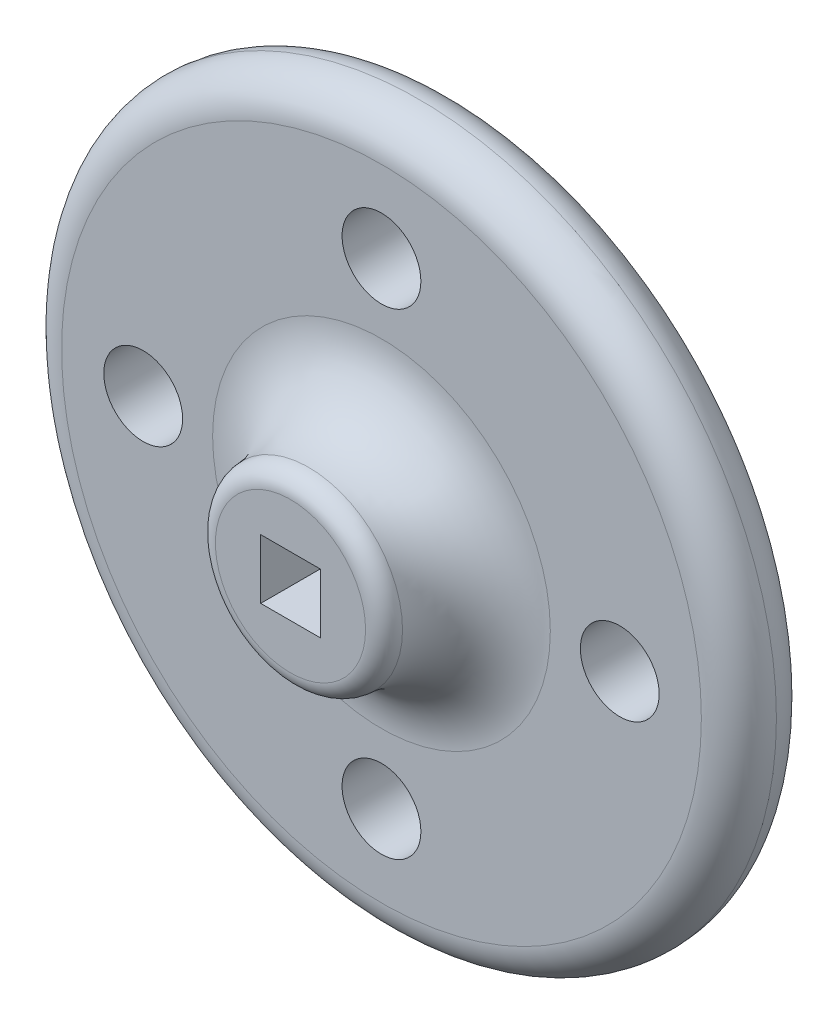
ISO-10303-21;
HEADER;
FILE_DESCRIPTION(('STEP AP214'),'2;1');
FILE_NAME('part.step','',(''),(''),'','','');
FILE_SCHEMA(('AUTOMOTIVE_DESIGN { 1 0 10303 214 1 1 1 1 }'));
ENDSEC;
DATA;
#1=APPLICATION_CONTEXT('core data for automotive mechanical design processes');
#2=APPLICATION_PROTOCOL_DEFINITION('international standard','automotive_design',2000,#1);
#3=PRODUCT_CONTEXT('',#1,'mechanical');
#4=PRODUCT('Part','Part','',(#3));
#5=PRODUCT_RELATED_PRODUCT_CATEGORY('part','',(#4));
#6=PRODUCT_DEFINITION_FORMATION('','',#4);
#7=PRODUCT_DEFINITION_CONTEXT('part definition',#1,'design');
#8=PRODUCT_DEFINITION('design','',#6,#7);
#9=PRODUCT_DEFINITION_SHAPE('','',#8);
#10=(LENGTH_UNIT() NAMED_UNIT(*) SI_UNIT(.MILLI.,.METRE.));
#11=(NAMED_UNIT(*) PLANE_ANGLE_UNIT() SI_UNIT($,.RADIAN.));
#12=(NAMED_UNIT(*) SI_UNIT($,.STERADIAN.) SOLID_ANGLE_UNIT());
#13=UNCERTAINTY_MEASURE_WITH_UNIT(LENGTH_MEASURE(1.E-05),#10,'distance_accuracy_value','');
#14=(GEOMETRIC_REPRESENTATION_CONTEXT(3) GLOBAL_UNCERTAINTY_ASSIGNED_CONTEXT((#13)) GLOBAL_UNIT_ASSIGNED_CONTEXT((#10,
#11,#12)) REPRESENTATION_CONTEXT('',''));
#15=CARTESIAN_POINT('',(0.,0.,0.));
#16=DIRECTION('',(0.,0.,1.));
#17=DIRECTION('',(1.,0.,0.));
#18=AXIS2_PLACEMENT_3D('',#15,#16,#17);
#19=CARTESIAN_POINT('',(0.,0.,4.));
#20=DIRECTION('',(0.,0.,1.));
#21=DIRECTION('',(1.,0.,0.));
#22=AXIS2_PLACEMENT_3D('',#19,#20,#21);
#23=PLANE('',#22);
#24=CARTESIAN_POINT('',(0.,0.,4.));
#25=DIRECTION('',(0.,0.,1.));
#26=DIRECTION('',(1.,0.,0.));
#27=AXIS2_PLACEMENT_3D('',#24,#25,#26);
#28=CIRCLE('',#27,17.05);
#29=CARTESIAN_POINT('',(17.05,0.,4.));
#30=VERTEX_POINT('',#29);
#31=EDGE_CURVE('E12',#30,#30,#28,.T.);
#32=ORIENTED_EDGE('',*,*,#31,.T.);
#33=EDGE_LOOP('',(#32));
#34=FACE_BOUND('',#33,.T.);
#35=CARTESIAN_POINT('',(0.,0.,4.));
#36=DIRECTION('',(0.,0.,1.));
#37=DIRECTION('',(1.,0.,0.));
#38=AXIS2_PLACEMENT_3D('',#35,#36,#37);
#39=CIRCLE('',#38,9.);
#40=CARTESIAN_POINT('',(9.,0.,4.));
#41=VERTEX_POINT('',#40);
#42=EDGE_CURVE('E179',#41,#41,#39,.F.);
#43=ORIENTED_EDGE('',*,*,#42,.T.);
#44=EDGE_LOOP('',(#43));
#45=FACE_BOUND('',#44,.T.);
#46=CARTESIAN_POINT('',(0.,12.7,4.));
#47=DIRECTION('',(0.,0.,1.));
#48=DIRECTION('',(1.,0.,0.));
#49=AXIS2_PLACEMENT_3D('',#46,#47,#48);
#50=CIRCLE('',#49,2.1);
#51=CARTESIAN_POINT('',(2.1,12.7,4.));
#52=VERTEX_POINT('',#51);
#53=EDGE_CURVE('E142',#52,#52,#50,.T.);
#54=ORIENTED_EDGE('',*,*,#53,.F.);
#55=EDGE_LOOP('',(#54));
#56=FACE_BOUND('',#55,.T.);
#57=CARTESIAN_POINT('',(-12.7,0.,4.));
#58=DIRECTION('',(0.,0.,1.));
#59=DIRECTION('',(1.,0.,0.));
#60=AXIS2_PLACEMENT_3D('',#57,#58,#59);
#61=CIRCLE('',#60,2.1);
#62=CARTESIAN_POINT('',(-10.6,0.,4.));
#63=VERTEX_POINT('',#62);
#64=EDGE_CURVE('E138',#63,#63,#61,.T.);
#65=ORIENTED_EDGE('',*,*,#64,.F.);
#66=EDGE_LOOP('',(#65));
#67=FACE_BOUND('',#66,.T.);
#68=CARTESIAN_POINT('',(0.,-12.7,4.));
#69=DIRECTION('',(0.,0.,1.));
#70=DIRECTION('',(1.,0.,0.));
#71=AXIS2_PLACEMENT_3D('',#68,#69,#70);
#72=CIRCLE('',#71,2.1);
#73=CARTESIAN_POINT('',(2.1,-12.7,4.));
#74=VERTEX_POINT('',#73);
#75=EDGE_CURVE('E134',#74,#74,#72,.T.);
#76=ORIENTED_EDGE('',*,*,#75,.F.);
#77=EDGE_LOOP('',(#76));
#78=FACE_BOUND('',#77,.T.);
#79=CARTESIAN_POINT('',(12.7,0.,4.));
#80=DIRECTION('',(0.,0.,1.));
#81=DIRECTION('',(1.,0.,0.));
#82=AXIS2_PLACEMENT_3D('',#79,#80,#81);
#83=CIRCLE('',#82,2.1);
#84=CARTESIAN_POINT('',(14.8,0.,4.));
#85=VERTEX_POINT('',#84);
#86=EDGE_CURVE('E130',#85,#85,#83,.T.);
#87=ORIENTED_EDGE('',*,*,#86,.F.);
#88=EDGE_LOOP('',(#87));
#89=FACE_BOUND('',#88,.T.);
#90=ADVANCED_FACE('F55',(#34,#45,#56,#67,#78,#89),#23,.T.);
#91=CARTESIAN_POINT('',(-1.5875,0.,4.));
#92=DIRECTION('',(1.,0.,0.));
#93=DIRECTION('',(0.,1.,0.));
#94=AXIS2_PLACEMENT_3D('',#91,#92,#93);
#95=PLANE('',#94);
#96=DIRECTION('',(0.,-1.,0.));
#97=VECTOR('',#96,1.);
#98=CARTESIAN_POINT('',(-1.5875,0.,0.));
#99=LINE('',#98,#97);
#100=CARTESIAN_POINT('',(-1.5875,1.5875,0.));
#101=VERTEX_POINT('',#100);
#102=CARTESIAN_POINT('',(-1.5875,-1.5875,0.));
#103=VERTEX_POINT('',#102);
#104=EDGE_CURVE('E161',#101,#103,#99,.T.);
#105=ORIENTED_EDGE('',*,*,#104,.F.);
#106=DIRECTION('',(0.,0.,-1.));
#107=VECTOR('',#106,1.);
#108=CARTESIAN_POINT('',(-1.5875,1.5875,4.));
#109=LINE('',#108,#107);
#110=CARTESIAN_POINT('',(-1.5875,1.5875,8.85));
#111=VERTEX_POINT('',#110);
#112=EDGE_CURVE('E176',#111,#101,#109,.T.);
#113=ORIENTED_EDGE('',*,*,#112,.F.);
#114=DIRECTION('',(0.,1.,0.));
#115=VECTOR('',#114,1.);
#116=CARTESIAN_POINT('',(-1.5875,0.,8.85));
#117=LINE('',#116,#115);
#118=CARTESIAN_POINT('',(-1.5875,-1.5875,8.85));
#119=VERTEX_POINT('',#118);
#120=EDGE_CURVE('E124',#119,#111,#117,.T.);
#121=ORIENTED_EDGE('',*,*,#120,.F.);
#122=DIRECTION('',(0.,0.,-1.));
#123=VECTOR('',#122,1.);
#124=CARTESIAN_POINT('',(-1.5875,-1.5875,4.));
#125=LINE('',#124,#123);
#126=EDGE_CURVE('E72',#119,#103,#125,.T.);
#127=ORIENTED_EDGE('',*,*,#126,.T.);
#128=EDGE_LOOP('',(#105,#113,#121,#127));
#129=FACE_BOUND('',#128,.T.);
#130=ADVANCED_FACE('F216',(#129),#95,.T.);
#131=CARTESIAN_POINT('',(0.,1.5875,4.));
#132=DIRECTION('',(0.,-1.,0.));
#133=DIRECTION('',(1.,0.,0.));
#134=AXIS2_PLACEMENT_3D('',#131,#132,#133);
#135=PLANE('',#134);
#136=DIRECTION('',(-1.,0.,0.));
#137=VECTOR('',#136,1.);
#138=CARTESIAN_POINT('',(0.,1.5875,0.));
#139=LINE('',#138,#137);
#140=CARTESIAN_POINT('',(1.5875,1.5875,0.));
#141=VERTEX_POINT('',#140);
#142=EDGE_CURVE('E164',#141,#101,#139,.T.);
#143=ORIENTED_EDGE('',*,*,#142,.F.);
#144=DIRECTION('',(0.,0.,-1.));
#145=VECTOR('',#144,1.);
#146=CARTESIAN_POINT('',(1.5875,1.5875,4.));
#147=LINE('',#146,#145);
#148=CARTESIAN_POINT('',(1.5875,1.5875,8.85));
#149=VERTEX_POINT('',#148);
#150=EDGE_CURVE('E109',#149,#141,#147,.T.);
#151=ORIENTED_EDGE('',*,*,#150,.F.);
#152=DIRECTION('',(1.,0.,0.));
#153=VECTOR('',#152,1.);
#154=CARTESIAN_POINT('',(0.,1.5875,8.85));
#155=LINE('',#154,#153);
#156=EDGE_CURVE('E120',#111,#149,#155,.T.);
#157=ORIENTED_EDGE('',*,*,#156,.F.);
#158=ORIENTED_EDGE('',*,*,#112,.T.);
#159=EDGE_LOOP('',(#143,#151,#157,#158));
#160=FACE_BOUND('',#159,.T.);
#161=ADVANCED_FACE('F222',(#160),#135,.T.);
#162=CARTESIAN_POINT('',(1.5875,0.,4.));
#163=DIRECTION('',(1.,0.,0.));
#164=DIRECTION('',(0.,1.,0.));
#165=AXIS2_PLACEMENT_3D('',#162,#163,#164);
#166=PLANE('',#165);
#167=DIRECTION('',(0.,-1.,0.));
#168=VECTOR('',#167,1.);
#169=CARTESIAN_POINT('',(1.5875,0.,0.));
#170=LINE('',#169,#168);
#171=CARTESIAN_POINT('',(1.5875,-1.5875,0.));
#172=VERTEX_POINT('',#171);
#173=EDGE_CURVE('E106',#141,#172,#170,.T.);
#174=ORIENTED_EDGE('',*,*,#173,.T.);
#175=DIRECTION('',(0.,0.,-1.));
#176=VECTOR('',#175,1.);
#177=CARTESIAN_POINT('',(1.5875,-1.5875,4.));
#178=LINE('',#177,#176);
#179=CARTESIAN_POINT('',(1.5875,-1.5875,8.85));
#180=VERTEX_POINT('',#179);
#181=EDGE_CURVE('E100',#180,#172,#178,.T.);
#182=ORIENTED_EDGE('',*,*,#181,.F.);
#183=DIRECTION('',(0.,1.,0.));
#184=VECTOR('',#183,1.);
#185=CARTESIAN_POINT('',(1.5875,0.,8.85));
#186=LINE('',#185,#184);
#187=EDGE_CURVE('E104',#180,#149,#186,.T.);
#188=ORIENTED_EDGE('',*,*,#187,.T.);
#189=ORIENTED_EDGE('',*,*,#150,.T.);
#190=EDGE_LOOP('',(#174,#182,#188,#189));
#191=FACE_BOUND('',#190,.T.);
#192=ADVANCED_FACE('F102',(#191),#166,.F.);
#193=CARTESIAN_POINT('',(0.,12.7,4.));
#194=DIRECTION('',(0.,0.,-1.));
#195=DIRECTION('',(-1.,0.,0.));
#196=AXIS2_PLACEMENT_3D('',#193,#194,#195);
#197=CYLINDRICAL_SURFACE('',#196,2.1);
#198=ORIENTED_EDGE('',*,*,#53,.T.);
#199=EDGE_LOOP('',(#198));
#200=FACE_BOUND('',#199,.T.);
#201=CARTESIAN_POINT('',(0.,12.7,0.));
#202=DIRECTION('',(0.,0.,1.));
#203=DIRECTION('',(1.,0.,0.));
#204=AXIS2_PLACEMENT_3D('',#201,#202,#203);
#205=CIRCLE('',#204,2.1);
#206=CARTESIAN_POINT('',(2.1,12.7,0.));
#207=VERTEX_POINT('',#206);
#208=EDGE_CURVE('E157',#207,#207,#205,.T.);
#209=ORIENTED_EDGE('',*,*,#208,.F.);
#210=EDGE_LOOP('',(#209));
#211=FACE_BOUND('',#210,.T.);
#212=ADVANCED_FACE('F234',(#200,#211),#197,.F.);
#213=CARTESIAN_POINT('',(-12.7,0.,4.));
#214=DIRECTION('',(0.,0.,-1.));
#215=DIRECTION('',(-1.,0.,0.));
#216=AXIS2_PLACEMENT_3D('',#213,#214,#215);
#217=CYLINDRICAL_SURFACE('',#216,2.1);
#218=ORIENTED_EDGE('',*,*,#64,.T.);
#219=EDGE_LOOP('',(#218));
#220=FACE_BOUND('',#219,.T.);
#221=CARTESIAN_POINT('',(-12.7,0.,0.));
#222=DIRECTION('',(0.,0.,1.));
#223=DIRECTION('',(1.,0.,0.));
#224=AXIS2_PLACEMENT_3D('',#221,#222,#223);
#225=CIRCLE('',#224,2.1);
#226=CARTESIAN_POINT('',(-10.6,0.,0.));
#227=VERTEX_POINT('',#226);
#228=EDGE_CURVE('E153',#227,#227,#225,.T.);
#229=ORIENTED_EDGE('',*,*,#228,.F.);
#230=EDGE_LOOP('',(#229));
#231=FACE_BOUND('',#230,.T.);
#232=ADVANCED_FACE('F240',(#220,#231),#217,.F.);
#233=CARTESIAN_POINT('',(0.,-12.7,4.));
#234=DIRECTION('',(0.,0.,-1.));
#235=DIRECTION('',(-1.,0.,0.));
#236=AXIS2_PLACEMENT_3D('',#233,#234,#235);
#237=CYLINDRICAL_SURFACE('',#236,2.1);
#238=ORIENTED_EDGE('',*,*,#75,.T.);
#239=EDGE_LOOP('',(#238));
#240=FACE_BOUND('',#239,.T.);
#241=CARTESIAN_POINT('',(0.,-12.7,0.));
#242=DIRECTION('',(0.,0.,1.));
#243=DIRECTION('',(1.,0.,0.));
#244=AXIS2_PLACEMENT_3D('',#241,#242,#243);
#245=CIRCLE('',#244,2.1);
#246=CARTESIAN_POINT('',(2.1,-12.7,0.));
#247=VERTEX_POINT('',#246);
#248=EDGE_CURVE('E149',#247,#247,#245,.T.);
#249=ORIENTED_EDGE('',*,*,#248,.F.);
#250=EDGE_LOOP('',(#249));
#251=FACE_BOUND('',#250,.T.);
#252=ADVANCED_FACE('F244',(#240,#251),#237,.F.);
#253=CARTESIAN_POINT('',(12.7,0.,4.));
#254=DIRECTION('',(0.,0.,-1.));
#255=DIRECTION('',(-1.,0.,0.));
#256=AXIS2_PLACEMENT_3D('',#253,#254,#255);
#257=CYLINDRICAL_SURFACE('',#256,2.1);
#258=ORIENTED_EDGE('',*,*,#86,.T.);
#259=EDGE_LOOP('',(#258));
#260=FACE_BOUND('',#259,.T.);
#261=CARTESIAN_POINT('',(12.7,0.,0.));
#262=DIRECTION('',(0.,0.,1.));
#263=DIRECTION('',(1.,0.,0.));
#264=AXIS2_PLACEMENT_3D('',#261,#262,#263);
#265=CIRCLE('',#264,2.1);
#266=CARTESIAN_POINT('',(14.8,0.,0.));
#267=VERTEX_POINT('',#266);
#268=EDGE_CURVE('E129',#267,#267,#265,.T.);
#269=ORIENTED_EDGE('',*,*,#268,.F.);
#270=EDGE_LOOP('',(#269));
#271=FACE_BOUND('',#270,.T.);
#272=ADVANCED_FACE('F231',(#260,#271),#257,.F.);
#273=CARTESIAN_POINT('',(0.,-1.5875,4.));
#274=DIRECTION('',(0.,-1.,0.));
#275=DIRECTION('',(1.,0.,0.));
#276=AXIS2_PLACEMENT_3D('',#273,#274,#275);
#277=PLANE('',#276);
#278=DIRECTION('',(-1.,0.,0.));
#279=VECTOR('',#278,1.);
#280=CARTESIAN_POINT('',(0.,-1.5875,0.));
#281=LINE('',#280,#279);
#282=EDGE_CURVE('E79',#172,#103,#281,.T.);
#283=ORIENTED_EDGE('',*,*,#282,.T.);
#284=ORIENTED_EDGE('',*,*,#126,.F.);
#285=DIRECTION('',(1.,0.,0.));
#286=VECTOR('',#285,1.);
#287=CARTESIAN_POINT('',(0.,-1.5875,8.85));
#288=LINE('',#287,#286);
#289=EDGE_CURVE('E112',#119,#180,#288,.T.);
#290=ORIENTED_EDGE('',*,*,#289,.T.);
#291=ORIENTED_EDGE('',*,*,#181,.T.);
#292=EDGE_LOOP('',(#283,#284,#290,#291));
#293=FACE_BOUND('',#292,.T.);
#294=ADVANCED_FACE('F113',(#293),#277,.F.);
#295=CARTESIAN_POINT('',(0.,0.,0.));
#296=DIRECTION('',(0.,0.,1.));
#297=DIRECTION('',(1.,0.,0.));
#298=AXIS2_PLACEMENT_3D('',#295,#296,#297);
#299=PLANE('',#298);
#300=CARTESIAN_POINT('',(0.,0.,0.));
#301=DIRECTION('',(0.,0.,1.));
#302=DIRECTION('',(1.,0.,0.));
#303=AXIS2_PLACEMENT_3D('',#300,#301,#302);
#304=CIRCLE('',#303,17.05);
#305=CARTESIAN_POINT('',(17.05,0.,0.));
#306=VERTEX_POINT('',#305);
#307=EDGE_CURVE('E65',#306,#306,#304,.F.);
#308=ORIENTED_EDGE('',*,*,#307,.T.);
#309=EDGE_LOOP('',(#308));
#310=FACE_BOUND('',#309,.T.);
#311=ORIENTED_EDGE('',*,*,#268,.T.);
#312=EDGE_LOOP('',(#311));
#313=FACE_BOUND('',#312,.T.);
#314=ORIENTED_EDGE('',*,*,#248,.T.);
#315=EDGE_LOOP('',(#314));
#316=FACE_BOUND('',#315,.T.);
#317=ORIENTED_EDGE('',*,*,#228,.T.);
#318=EDGE_LOOP('',(#317));
#319=FACE_BOUND('',#318,.T.);
#320=ORIENTED_EDGE('',*,*,#208,.T.);
#321=EDGE_LOOP('',(#320));
#322=FACE_BOUND('',#321,.T.);
#323=ORIENTED_EDGE('',*,*,#104,.T.);
#324=ORIENTED_EDGE('',*,*,#282,.F.);
#325=ORIENTED_EDGE('',*,*,#173,.F.);
#326=ORIENTED_EDGE('',*,*,#142,.T.);
#327=EDGE_LOOP('',(#323,#324,#325,#326));
#328=FACE_BOUND('',#327,.T.);
#329=ADVANCED_FACE('F195',(#310,#313,#316,#319,#322,#328),#299,.F.);
#330=CARTESIAN_POINT('',(0.,0.,8.85));
#331=DIRECTION('',(0.,0.,1.));
#332=DIRECTION('',(1.,0.,0.));
#333=AXIS2_PLACEMENT_3D('',#330,#331,#332);
#334=PLANE('',#333);
#335=CARTESIAN_POINT('',(0.,0.,8.85));
#336=DIRECTION('',(0.,0.,1.));
#337=DIRECTION('',(1.,0.,0.));
#338=AXIS2_PLACEMENT_3D('',#335,#336,#337);
#339=CIRCLE('',#338,4.00225050647794);
#340=CARTESIAN_POINT('',(4.00225050647794,0.,8.85));
#341=VERTEX_POINT('',#340);
#342=EDGE_CURVE('E183',#341,#341,#339,.T.);
#343=ORIENTED_EDGE('',*,*,#342,.T.);
#344=EDGE_LOOP('',(#343));
#345=FACE_BOUND('',#344,.T.);
#346=ORIENTED_EDGE('',*,*,#187,.F.);
#347=ORIENTED_EDGE('',*,*,#289,.F.);
#348=ORIENTED_EDGE('',*,*,#120,.T.);
#349=ORIENTED_EDGE('',*,*,#156,.T.);
#350=EDGE_LOOP('',(#346,#347,#348,#349));
#351=FACE_BOUND('',#350,.T.);
#352=ADVANCED_FACE('F118',(#345,#351),#334,.T.);
#353=CARTESIAN_POINT('',(0.,0.,8.));
#354=DIRECTION('',(0.,0.,1.));
#355=DIRECTION('',(1.,0.,0.));
#356=AXIS2_PLACEMENT_3D('',#353,#354,#355);
#357=TOROIDAL_SURFACE('',#356,9.,4.);
#358=CARTESIAN_POINT('',(0.,0.,7.88));
#359=DIRECTION('',(0.,0.,1.));
#360=DIRECTION('',(1.,0.,0.));
#361=AXIS2_PLACEMENT_3D('',#358,#359,#360);
#362=CIRCLE('',#361,5.00180040518235);
#363=CARTESIAN_POINT('',(5.00180040518235,0.,7.88));
#364=VERTEX_POINT('',#363);
#365=EDGE_CURVE('E187',#364,#364,#362,.F.);
#366=ORIENTED_EDGE('',*,*,#365,.T.);
#367=EDGE_LOOP('',(#366));
#368=FACE_BOUND('',#367,.T.);
#369=ORIENTED_EDGE('',*,*,#42,.F.);
#370=EDGE_LOOP('',(#369));
#371=FACE_BOUND('',#370,.T.);
#372=ADVANCED_FACE('F211',(#368,#371),#357,.F.);
#373=CARTESIAN_POINT('',(0.,0.,7.85));
#374=DIRECTION('',(0.,0.,-1.));
#375=DIRECTION('',(-1.,0.,0.));
#376=AXIS2_PLACEMENT_3D('',#373,#374,#375);
#377=TOROIDAL_SURFACE('',#376,4.00225050647794,1.);
#378=ORIENTED_EDGE('',*,*,#365,.F.);
#379=EDGE_LOOP('',(#378));
#380=FACE_BOUND('',#379,.T.);
#381=ORIENTED_EDGE('',*,*,#342,.F.);
#382=EDGE_LOOP('',(#381));
#383=FACE_BOUND('',#382,.T.);
#384=ADVANCED_FACE('F206',(#380,#383),#377,.T.);
#385=CARTESIAN_POINT('',(0.,0.,2.));
#386=DIRECTION('',(0.,0.,1.));
#387=DIRECTION('',(1.,0.,0.));
#388=AXIS2_PLACEMENT_3D('',#385,#386,#387);
#389=TOROIDAL_SURFACE('',#388,17.05,2.);
#390=ORIENTED_EDGE('',*,*,#31,.F.);
#391=EDGE_LOOP('',(#390));
#392=FACE_BOUND('',#391,.T.);
#393=CARTESIAN_POINT('',(0.,0.,2.));
#394=DIRECTION('',(0.,0.,1.));
#395=DIRECTION('',(1.,0.,0.));
#396=AXIS2_PLACEMENT_3D('',#393,#394,#395);
#397=CIRCLE('',#396,19.05);
#398=CARTESIAN_POINT('',(19.05,0.,2.));
#399=VERTEX_POINT('',#398);
#400=EDGE_CURVE('E59',#399,#399,#397,.F.);
#401=ORIENTED_EDGE('',*,*,#400,.F.);
#402=EDGE_LOOP('',(#401));
#403=FACE_BOUND('',#402,.T.);
#404=ADVANCED_FACE('F57',(#392,#403),#389,.T.);
#405=CARTESIAN_POINT('',(0.,0.,2.));
#406=DIRECTION('',(0.,0.,1.));
#407=DIRECTION('',(1.,0.,0.));
#408=AXIS2_PLACEMENT_3D('',#405,#406,#407);
#409=TOROIDAL_SURFACE('',#408,17.05,2.);
#410=ORIENTED_EDGE('',*,*,#307,.F.);
#411=EDGE_LOOP('',(#410));
#412=FACE_BOUND('',#411,.T.);
#413=ORIENTED_EDGE('',*,*,#400,.T.);
#414=EDGE_LOOP('',(#413));
#415=FACE_BOUND('',#414,.T.);
#416=ADVANCED_FACE('F198',(#412,#415),#409,.T.);
#417=CLOSED_SHELL('',(#90,#130,#161,#192,#212,#232,#252,#272,#294,#329,#352,#372,#384,#404,#416));
#418=MANIFOLD_SOLID_BREP('B2',#417);
#419=ADVANCED_BREP_SHAPE_REPRESENTATION('',(#18,#418),#14);
#420=SHAPE_DEFINITION_REPRESENTATION(#9,#419);
ENDSEC;
END-ISO-10303-21;
